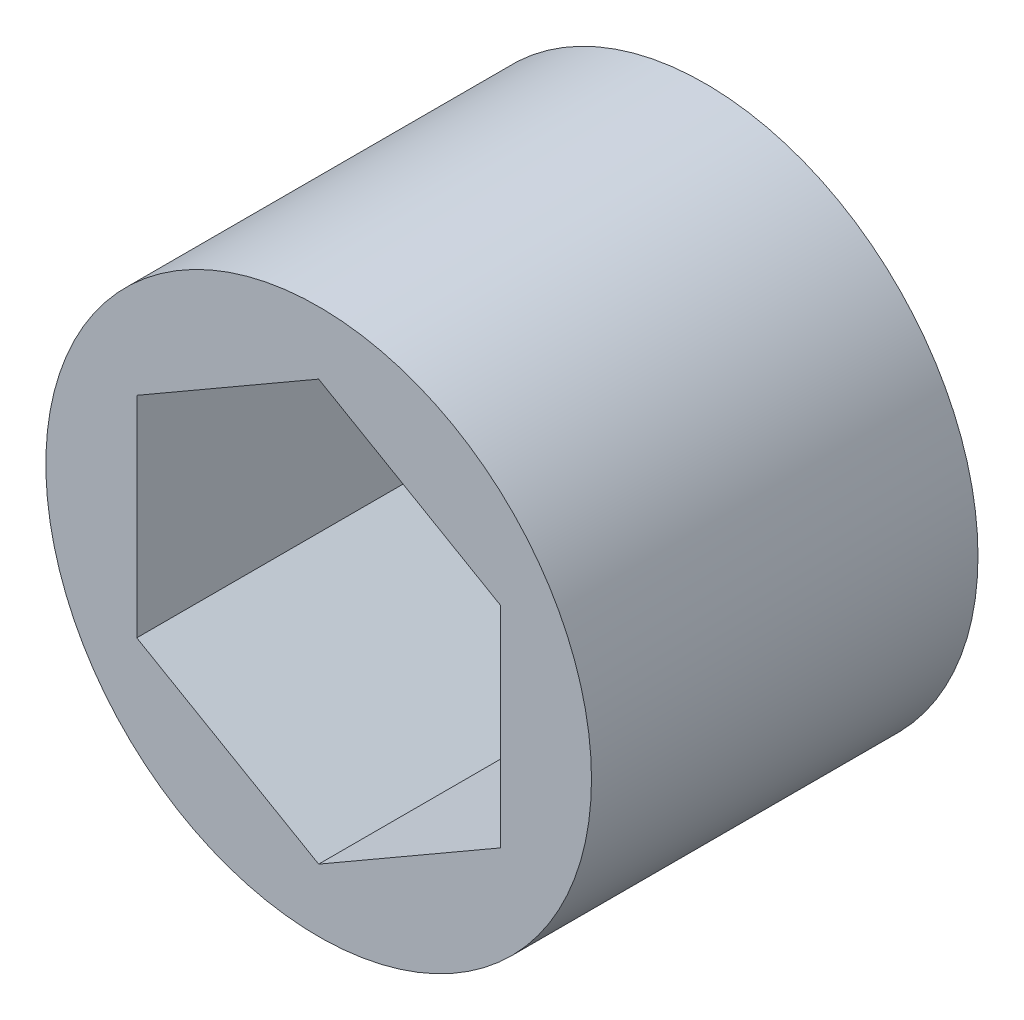
ISO-10303-21;
HEADER;
FILE_DESCRIPTION(('STEP AP214'),'2;1');
FILE_NAME('part.step','',(''),(''),'','','');
FILE_SCHEMA(('AUTOMOTIVE_DESIGN { 1 0 10303 214 1 1 1 1 }'));
ENDSEC;
DATA;
#1=APPLICATION_CONTEXT('core data for automotive mechanical design processes');
#2=APPLICATION_PROTOCOL_DEFINITION('international standard','automotive_design',2000,#1);
#3=PRODUCT_CONTEXT('',#1,'mechanical');
#4=PRODUCT('Part','Part','',(#3));
#5=PRODUCT_RELATED_PRODUCT_CATEGORY('part','',(#4));
#6=PRODUCT_DEFINITION_FORMATION('','',#4);
#7=PRODUCT_DEFINITION_CONTEXT('part definition',#1,'design');
#8=PRODUCT_DEFINITION('design','',#6,#7);
#9=PRODUCT_DEFINITION_SHAPE('','',#8);
#10=(LENGTH_UNIT() NAMED_UNIT(*) SI_UNIT(.MILLI.,.METRE.));
#11=(NAMED_UNIT(*) PLANE_ANGLE_UNIT() SI_UNIT($,.RADIAN.));
#12=(NAMED_UNIT(*) SI_UNIT($,.STERADIAN.) SOLID_ANGLE_UNIT());
#13=UNCERTAINTY_MEASURE_WITH_UNIT(LENGTH_MEASURE(1.E-05),#10,'distance_accuracy_value','');
#14=(GEOMETRIC_REPRESENTATION_CONTEXT(3) GLOBAL_UNCERTAINTY_ASSIGNED_CONTEXT((#13)) GLOBAL_UNIT_ASSIGNED_CONTEXT((#10,
#11,#12)) REPRESENTATION_CONTEXT('',''));
#15=CARTESIAN_POINT('',(0.,0.,0.));
#16=DIRECTION('',(0.,0.,1.));
#17=DIRECTION('',(1.,0.,0.));
#18=AXIS2_PLACEMENT_3D('',#15,#16,#17);
#19=CARTESIAN_POINT('',(0.,0.,6.746875));
#20=DIRECTION('',(0.,0.,1.));
#21=DIRECTION('',(1.,0.,0.));
#22=AXIS2_PLACEMENT_3D('',#19,#20,#21);
#23=PLANE('',#22);
#24=CARTESIAN_POINT('',(0.,0.,6.746875));
#25=DIRECTION('',(0.,0.,1.));
#26=DIRECTION('',(1.,0.,0.));
#27=AXIS2_PLACEMENT_3D('',#24,#25,#26);
#28=CIRCLE('',#27,9.525);
#29=CARTESIAN_POINT('',(9.525,0.,6.746875));
#30=VERTEX_POINT('',#29);
#31=EDGE_CURVE('E11',#30,#30,#28,.T.);
#32=ORIENTED_EDGE('',*,*,#31,.T.);
#33=EDGE_LOOP('',(#32));
#34=FACE_BOUND('',#33,.T.);
#35=DIRECTION('',(-0.866025403784439,-0.5,0.));
#36=VECTOR('',#35,1.);
#37=CARTESIAN_POINT('',(0.,7.33234841870825,6.746875));
#38=LINE('',#37,#36);
#39=CARTESIAN_POINT('',(0.,7.33234841870825,6.746875));
#40=VERTEX_POINT('',#39);
#41=CARTESIAN_POINT('',(-6.35,3.66617420935412,6.746875));
#42=VERTEX_POINT('',#41);
#43=EDGE_CURVE('E106',#40,#42,#38,.T.);
#44=ORIENTED_EDGE('',*,*,#43,.F.);
#45=DIRECTION('',(-0.866025403784439,0.5,0.));
#46=VECTOR('',#45,1.);
#47=CARTESIAN_POINT('',(6.35,3.66617420935413,6.746875));
#48=LINE('',#47,#46);
#49=CARTESIAN_POINT('',(6.35,3.66617420935413,6.746875));
#50=VERTEX_POINT('',#49);
#51=EDGE_CURVE('E97',#50,#40,#48,.T.);
#52=ORIENTED_EDGE('',*,*,#51,.F.);
#53=DIRECTION('',(0.,1.,0.));
#54=VECTOR('',#53,1.);
#55=CARTESIAN_POINT('',(6.35,-3.66617420935412,6.746875));
#56=LINE('',#55,#54);
#57=CARTESIAN_POINT('',(6.35,-3.66617420935412,6.746875));
#58=VERTEX_POINT('',#57);
#59=EDGE_CURVE('E131',#58,#50,#56,.T.);
#60=ORIENTED_EDGE('',*,*,#59,.F.);
#61=DIRECTION('',(0.866025403784438,0.5,0.));
#62=VECTOR('',#61,1.);
#63=CARTESIAN_POINT('',(0.,-7.33234841870825,6.746875));
#64=LINE('',#63,#62);
#65=CARTESIAN_POINT('',(0.,-7.33234841870825,6.746875));
#66=VERTEX_POINT('',#65);
#67=EDGE_CURVE('E128',#66,#58,#64,.T.);
#68=ORIENTED_EDGE('',*,*,#67,.F.);
#69=DIRECTION('',(0.866025403784439,-0.5,0.));
#70=VECTOR('',#69,1.);
#71=CARTESIAN_POINT('',(-6.35,-3.66617420935412,6.746875));
#72=LINE('',#71,#70);
#73=CARTESIAN_POINT('',(-6.35,-3.66617420935412,6.746875));
#74=VERTEX_POINT('',#73);
#75=EDGE_CURVE('E123',#74,#66,#72,.T.);
#76=ORIENTED_EDGE('',*,*,#75,.F.);
#77=DIRECTION('',(0.,-1.,0.));
#78=VECTOR('',#77,1.);
#79=CARTESIAN_POINT('',(-6.35,3.66617420935412,6.746875));
#80=LINE('',#79,#78);
#81=EDGE_CURVE('E119',#42,#74,#80,.T.);
#82=ORIENTED_EDGE('',*,*,#81,.F.);
#83=EDGE_LOOP('',(#44,#52,#60,#68,#76,#82));
#84=FACE_BOUND('',#83,.T.);
#85=ADVANCED_FACE('F43',(#34,#84),#23,.T.);
#86=CARTESIAN_POINT('',(0.,0.,-6.746875));
#87=DIRECTION('',(0.,0.,1.));
#88=DIRECTION('',(1.,0.,0.));
#89=AXIS2_PLACEMENT_3D('',#86,#87,#88);
#90=PLANE('',#89);
#91=CARTESIAN_POINT('',(0.,0.,-6.746875));
#92=DIRECTION('',(0.,0.,1.));
#93=DIRECTION('',(1.,0.,0.));
#94=AXIS2_PLACEMENT_3D('',#91,#92,#93);
#95=CIRCLE('',#94,9.525);
#96=CARTESIAN_POINT('',(9.525,0.,-6.746875));
#97=VERTEX_POINT('',#96);
#98=EDGE_CURVE('E47',#97,#97,#95,.T.);
#99=ORIENTED_EDGE('',*,*,#98,.F.);
#100=EDGE_LOOP('',(#99));
#101=FACE_BOUND('',#100,.T.);
#102=DIRECTION('',(-0.866025403784439,0.5,0.));
#103=VECTOR('',#102,1.);
#104=CARTESIAN_POINT('',(6.35,3.66617420935413,-6.746875));
#105=LINE('',#104,#103);
#106=CARTESIAN_POINT('',(6.35,3.66617420935413,-6.746875));
#107=VERTEX_POINT('',#106);
#108=CARTESIAN_POINT('',(0.,7.33234841870825,-6.746875));
#109=VERTEX_POINT('',#108);
#110=EDGE_CURVE('E67',#107,#109,#105,.T.);
#111=ORIENTED_EDGE('',*,*,#110,.T.);
#112=DIRECTION('',(-0.866025403784439,-0.5,0.));
#113=VECTOR('',#112,1.);
#114=CARTESIAN_POINT('',(0.,7.33234841870825,-6.746875));
#115=LINE('',#114,#113);
#116=CARTESIAN_POINT('',(-6.35,3.66617420935412,-6.746875));
#117=VERTEX_POINT('',#116);
#118=EDGE_CURVE('E113',#109,#117,#115,.T.);
#119=ORIENTED_EDGE('',*,*,#118,.T.);
#120=DIRECTION('',(0.,-1.,0.));
#121=VECTOR('',#120,1.);
#122=CARTESIAN_POINT('',(-6.35,3.66617420935412,-6.746875));
#123=LINE('',#122,#121);
#124=CARTESIAN_POINT('',(-6.35,-3.66617420935412,-6.746875));
#125=VERTEX_POINT('',#124);
#126=EDGE_CURVE('E138',#117,#125,#123,.T.);
#127=ORIENTED_EDGE('',*,*,#126,.T.);
#128=DIRECTION('',(0.866025403784439,-0.5,0.));
#129=VECTOR('',#128,1.);
#130=CARTESIAN_POINT('',(-6.35,-3.66617420935412,-6.746875));
#131=LINE('',#130,#129);
#132=CARTESIAN_POINT('',(0.,-7.33234841870825,-6.746875));
#133=VERTEX_POINT('',#132);
#134=EDGE_CURVE('E142',#125,#133,#131,.T.);
#135=ORIENTED_EDGE('',*,*,#134,.T.);
#136=DIRECTION('',(0.866025403784438,0.5,0.));
#137=VECTOR('',#136,1.);
#138=CARTESIAN_POINT('',(0.,-7.33234841870825,-6.746875));
#139=LINE('',#138,#137);
#140=CARTESIAN_POINT('',(6.35,-3.66617420935412,-6.746875));
#141=VERTEX_POINT('',#140);
#142=EDGE_CURVE('E146',#133,#141,#139,.T.);
#143=ORIENTED_EDGE('',*,*,#142,.T.);
#144=DIRECTION('',(0.,1.,0.));
#145=VECTOR('',#144,1.);
#146=CARTESIAN_POINT('',(6.35,-3.66617420935412,-6.746875));
#147=LINE('',#146,#145);
#148=EDGE_CURVE('E107',#141,#107,#147,.T.);
#149=ORIENTED_EDGE('',*,*,#148,.T.);
#150=EDGE_LOOP('',(#111,#119,#127,#135,#143,#149));
#151=FACE_BOUND('',#150,.T.);
#152=ADVANCED_FACE('F170',(#101,#151),#90,.F.);
#153=CARTESIAN_POINT('',(0.,0.,6.746875));
#154=DIRECTION('',(0.,0.,-1.));
#155=DIRECTION('',(-1.,0.,0.));
#156=AXIS2_PLACEMENT_3D('',#153,#154,#155);
#157=CYLINDRICAL_SURFACE('',#156,9.525);
#158=ORIENTED_EDGE('',*,*,#31,.F.);
#159=EDGE_LOOP('',(#158));
#160=FACE_BOUND('',#159,.T.);
#161=ORIENTED_EDGE('',*,*,#98,.T.);
#162=EDGE_LOOP('',(#161));
#163=FACE_BOUND('',#162,.T.);
#164=ADVANCED_FACE('F45',(#160,#163),#157,.T.);
#165=CARTESIAN_POINT('',(6.35,3.66617420935413,6.746875));
#166=DIRECTION('',(-0.5,-0.866025403784439,0.));
#167=DIRECTION('',(0.866025403784439,-0.5,0.));
#168=AXIS2_PLACEMENT_3D('',#165,#166,#167);
#169=PLANE('',#168);
#170=ORIENTED_EDGE('',*,*,#110,.F.);
#171=DIRECTION('',(0.,0.,-1.));
#172=VECTOR('',#171,1.);
#173=CARTESIAN_POINT('',(6.35,3.66617420935413,6.746875));
#174=LINE('',#173,#172);
#175=EDGE_CURVE('E101',#50,#107,#174,.T.);
#176=ORIENTED_EDGE('',*,*,#175,.F.);
#177=ORIENTED_EDGE('',*,*,#51,.T.);
#178=DIRECTION('',(0.,0.,-1.));
#179=VECTOR('',#178,1.);
#180=CARTESIAN_POINT('',(0.,7.33234841870825,6.746875));
#181=LINE('',#180,#179);
#182=EDGE_CURVE('E100',#40,#109,#181,.T.);
#183=ORIENTED_EDGE('',*,*,#182,.T.);
#184=EDGE_LOOP('',(#170,#176,#177,#183));
#185=FACE_BOUND('',#184,.T.);
#186=ADVANCED_FACE('F99',(#185),#169,.T.);
#187=CARTESIAN_POINT('',(0.,7.33234841870825,6.746875));
#188=DIRECTION('',(0.5,-0.866025403784439,0.));
#189=DIRECTION('',(0.866025403784439,0.5,0.));
#190=AXIS2_PLACEMENT_3D('',#187,#188,#189);
#191=PLANE('',#190);
#192=ORIENTED_EDGE('',*,*,#118,.F.);
#193=ORIENTED_EDGE('',*,*,#182,.F.);
#194=ORIENTED_EDGE('',*,*,#43,.T.);
#195=DIRECTION('',(0.,0.,-1.));
#196=VECTOR('',#195,1.);
#197=CARTESIAN_POINT('',(-6.35,3.66617420935412,6.746875));
#198=LINE('',#197,#196);
#199=EDGE_CURVE('E115',#42,#117,#198,.T.);
#200=ORIENTED_EDGE('',*,*,#199,.T.);
#201=EDGE_LOOP('',(#192,#193,#194,#200));
#202=FACE_BOUND('',#201,.T.);
#203=ADVANCED_FACE('F110',(#202),#191,.T.);
#204=CARTESIAN_POINT('',(-6.35,3.66617420935412,6.746875));
#205=DIRECTION('',(1.,0.,0.));
#206=DIRECTION('',(0.,1.,0.));
#207=AXIS2_PLACEMENT_3D('',#204,#205,#206);
#208=PLANE('',#207);
#209=ORIENTED_EDGE('',*,*,#126,.F.);
#210=ORIENTED_EDGE('',*,*,#199,.F.);
#211=ORIENTED_EDGE('',*,*,#81,.T.);
#212=DIRECTION('',(0.,0.,-1.));
#213=VECTOR('',#212,1.);
#214=CARTESIAN_POINT('',(-6.35,-3.66617420935412,6.746875));
#215=LINE('',#214,#213);
#216=EDGE_CURVE('E160',#74,#125,#215,.T.);
#217=ORIENTED_EDGE('',*,*,#216,.T.);
#218=EDGE_LOOP('',(#209,#210,#211,#217));
#219=FACE_BOUND('',#218,.T.);
#220=ADVANCED_FACE('F166',(#219),#208,.T.);
#221=CARTESIAN_POINT('',(-6.35,-3.66617420935412,6.746875));
#222=DIRECTION('',(0.5,0.866025403784439,0.));
#223=DIRECTION('',(-0.866025403784439,0.5,0.));
#224=AXIS2_PLACEMENT_3D('',#221,#222,#223);
#225=PLANE('',#224);
#226=ORIENTED_EDGE('',*,*,#134,.F.);
#227=ORIENTED_EDGE('',*,*,#216,.F.);
#228=ORIENTED_EDGE('',*,*,#75,.T.);
#229=DIRECTION('',(0.,0.,-1.));
#230=VECTOR('',#229,1.);
#231=CARTESIAN_POINT('',(0.,-7.33234841870825,6.746875));
#232=LINE('',#231,#230);
#233=EDGE_CURVE('E157',#66,#133,#232,.T.);
#234=ORIENTED_EDGE('',*,*,#233,.T.);
#235=EDGE_LOOP('',(#226,#227,#228,#234));
#236=FACE_BOUND('',#235,.T.);
#237=ADVANCED_FACE('F178',(#236),#225,.T.);
#238=CARTESIAN_POINT('',(0.,-7.33234841870825,6.746875));
#239=DIRECTION('',(-0.5,0.866025403784438,0.));
#240=DIRECTION('',(-0.866025403784439,-0.5,0.));
#241=AXIS2_PLACEMENT_3D('',#238,#239,#240);
#242=PLANE('',#241);
#243=ORIENTED_EDGE('',*,*,#142,.F.);
#244=ORIENTED_EDGE('',*,*,#233,.F.);
#245=ORIENTED_EDGE('',*,*,#67,.T.);
#246=DIRECTION('',(0.,0.,-1.));
#247=VECTOR('',#246,1.);
#248=CARTESIAN_POINT('',(6.35,-3.66617420935412,6.746875));
#249=LINE('',#248,#247);
#250=EDGE_CURVE('E59',#58,#141,#249,.T.);
#251=ORIENTED_EDGE('',*,*,#250,.T.);
#252=EDGE_LOOP('',(#243,#244,#245,#251));
#253=FACE_BOUND('',#252,.T.);
#254=ADVANCED_FACE('F176',(#253),#242,.T.);
#255=CARTESIAN_POINT('',(6.35,-3.66617420935412,6.746875));
#256=DIRECTION('',(-1.,0.,0.));
#257=DIRECTION('',(0.,-1.,0.));
#258=AXIS2_PLACEMENT_3D('',#255,#256,#257);
#259=PLANE('',#258);
#260=ORIENTED_EDGE('',*,*,#148,.F.);
#261=ORIENTED_EDGE('',*,*,#250,.F.);
#262=ORIENTED_EDGE('',*,*,#59,.T.);
#263=ORIENTED_EDGE('',*,*,#175,.T.);
#264=EDGE_LOOP('',(#260,#261,#262,#263));
#265=FACE_BOUND('',#264,.T.);
#266=ADVANCED_FACE('F172',(#265),#259,.T.);
#267=CLOSED_SHELL('',(#85,#152,#164,#186,#203,#220,#237,#254,#266));
#268=MANIFOLD_SOLID_BREP('B2',#267);
#269=ADVANCED_BREP_SHAPE_REPRESENTATION('',(#18,#268),#14);
#270=SHAPE_DEFINITION_REPRESENTATION(#9,#269);
ENDSEC;
END-ISO-10303-21;
